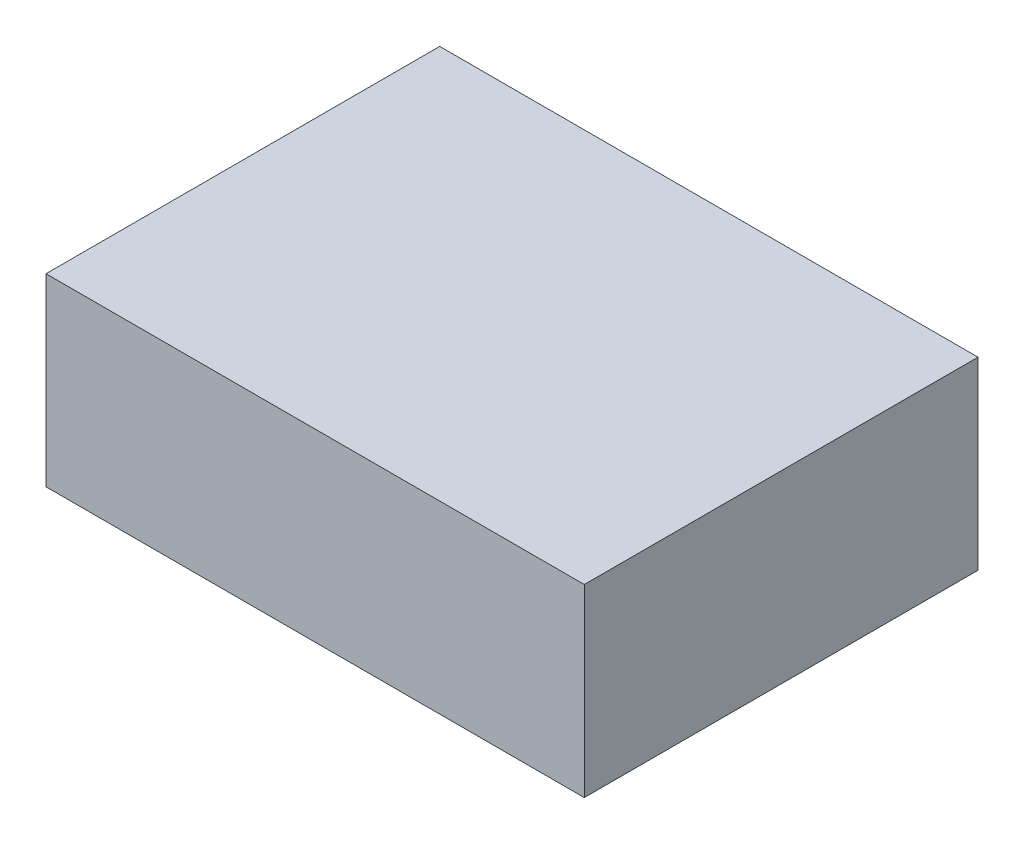
ISO-10303-21;
HEADER;
FILE_DESCRIPTION(('STEP AP214'),'2;1');
FILE_NAME('part.step','',(''),(''),'','','');
FILE_SCHEMA(('AUTOMOTIVE_DESIGN { 1 0 10303 214 1 1 1 1 }'));
ENDSEC;
DATA;
#1=APPLICATION_CONTEXT('core data for automotive mechanical design processes');
#2=APPLICATION_PROTOCOL_DEFINITION('international standard','automotive_design',2000,#1);
#3=PRODUCT_CONTEXT('',#1,'mechanical');
#4=PRODUCT('Part','Part','',(#3));
#5=PRODUCT_RELATED_PRODUCT_CATEGORY('part','',(#4));
#6=PRODUCT_DEFINITION_FORMATION('','',#4);
#7=PRODUCT_DEFINITION_CONTEXT('part definition',#1,'design');
#8=PRODUCT_DEFINITION('design','',#6,#7);
#9=PRODUCT_DEFINITION_SHAPE('','',#8);
#10=(LENGTH_UNIT() NAMED_UNIT(*) SI_UNIT(.MILLI.,.METRE.));
#11=(NAMED_UNIT(*) PLANE_ANGLE_UNIT() SI_UNIT($,.RADIAN.));
#12=(NAMED_UNIT(*) SI_UNIT($,.STERADIAN.) SOLID_ANGLE_UNIT());
#13=UNCERTAINTY_MEASURE_WITH_UNIT(LENGTH_MEASURE(1.E-05),#10,'distance_accuracy_value','');
#14=(GEOMETRIC_REPRESENTATION_CONTEXT(3) GLOBAL_UNCERTAINTY_ASSIGNED_CONTEXT((#13)) GLOBAL_UNIT_ASSIGNED_CONTEXT((#10,
#11,#12)) REPRESENTATION_CONTEXT('',''));
#15=CARTESIAN_POINT('',(0.,0.,0.));
#16=DIRECTION('',(0.,0.,1.));
#17=DIRECTION('',(1.,0.,0.));
#18=AXIS2_PLACEMENT_3D('',#15,#16,#17);
#19=CARTESIAN_POINT('',(87.5,60.,-64.));
#20=DIRECTION('',(-1.,0.,0.));
#21=DIRECTION('',(0.,0.,1.));
#22=AXIS2_PLACEMENT_3D('',#19,#20,#21);
#23=PLANE('',#22);
#24=DIRECTION('',(0.,0.,-1.));
#25=VECTOR('',#24,1.);
#26=CARTESIAN_POINT('',(87.5,0.,-64.));
#27=LINE('',#26,#25);
#28=CARTESIAN_POINT('',(87.5,0.,64.));
#29=VERTEX_POINT('',#28);
#30=CARTESIAN_POINT('',(87.5,0.,-64.));
#31=VERTEX_POINT('',#30);
#32=EDGE_CURVE('E113',#29,#31,#27,.T.);
#33=ORIENTED_EDGE('',*,*,#32,.T.);
#34=DIRECTION('',(0.,-1.,0.));
#35=VECTOR('',#34,1.);
#36=CARTESIAN_POINT('',(87.5,60.,-64.));
#37=LINE('',#36,#35);
#38=CARTESIAN_POINT('',(87.5,60.,-64.));
#39=VERTEX_POINT('',#38);
#40=EDGE_CURVE('E11',#39,#31,#37,.T.);
#41=ORIENTED_EDGE('',*,*,#40,.F.);
#42=DIRECTION('',(0.,0.,-1.));
#43=VECTOR('',#42,1.);
#44=CARTESIAN_POINT('',(87.5,60.,-64.));
#45=LINE('',#44,#43);
#46=CARTESIAN_POINT('',(87.5,60.,64.));
#47=VERTEX_POINT('',#46);
#48=EDGE_CURVE('E97',#47,#39,#45,.T.);
#49=ORIENTED_EDGE('',*,*,#48,.F.);
#50=DIRECTION('',(0.,-1.,0.));
#51=VECTOR('',#50,1.);
#52=CARTESIAN_POINT('',(87.5,60.,64.));
#53=LINE('',#52,#51);
#54=EDGE_CURVE('E109',#47,#29,#53,.T.);
#55=ORIENTED_EDGE('',*,*,#54,.T.);
#56=EDGE_LOOP('',(#33,#41,#49,#55));
#57=FACE_BOUND('',#56,.T.);
#58=ADVANCED_FACE('F45',(#57),#23,.F.);
#59=CARTESIAN_POINT('',(-87.5,60.,-64.));
#60=DIRECTION('',(0.,0.,1.));
#61=DIRECTION('',(1.,0.,0.));
#62=AXIS2_PLACEMENT_3D('',#59,#60,#61);
#63=PLANE('',#62);
#64=DIRECTION('',(-1.,0.,0.));
#65=VECTOR('',#64,1.);
#66=CARTESIAN_POINT('',(-87.5,0.,-64.));
#67=LINE('',#66,#65);
#68=CARTESIAN_POINT('',(-87.5,0.,-64.));
#69=VERTEX_POINT('',#68);
#70=EDGE_CURVE('E102',#31,#69,#67,.T.);
#71=ORIENTED_EDGE('',*,*,#70,.T.);
#72=DIRECTION('',(0.,-1.,0.));
#73=VECTOR('',#72,1.);
#74=CARTESIAN_POINT('',(-87.5,60.,-64.));
#75=LINE('',#74,#73);
#76=CARTESIAN_POINT('',(-87.5,60.,-64.));
#77=VERTEX_POINT('',#76);
#78=EDGE_CURVE('E54',#77,#69,#75,.T.);
#79=ORIENTED_EDGE('',*,*,#78,.F.);
#80=DIRECTION('',(-1.,0.,0.));
#81=VECTOR('',#80,1.);
#82=CARTESIAN_POINT('',(-87.5,60.,-64.));
#83=LINE('',#82,#81);
#84=EDGE_CURVE('E92',#39,#77,#83,.T.);
#85=ORIENTED_EDGE('',*,*,#84,.F.);
#86=ORIENTED_EDGE('',*,*,#40,.T.);
#87=EDGE_LOOP('',(#71,#79,#85,#86));
#88=FACE_BOUND('',#87,.T.);
#89=ADVANCED_FACE('F101',(#88),#63,.F.);
#90=CARTESIAN_POINT('',(-87.5,60.,-64.));
#91=DIRECTION('',(1.,0.,0.));
#92=DIRECTION('',(0.,0.,-1.));
#93=AXIS2_PLACEMENT_3D('',#90,#91,#92);
#94=PLANE('',#93);
#95=DIRECTION('',(0.,0.,1.));
#96=VECTOR('',#95,1.);
#97=CARTESIAN_POINT('',(-87.5,0.,-64.));
#98=LINE('',#97,#96);
#99=CARTESIAN_POINT('',(-87.5,0.,64.));
#100=VERTEX_POINT('',#99);
#101=EDGE_CURVE('E79',#69,#100,#98,.T.);
#102=ORIENTED_EDGE('',*,*,#101,.T.);
#103=DIRECTION('',(0.,-1.,0.));
#104=VECTOR('',#103,1.);
#105=CARTESIAN_POINT('',(-87.5,60.,64.));
#106=LINE('',#105,#104);
#107=CARTESIAN_POINT('',(-87.5,60.,64.));
#108=VERTEX_POINT('',#107);
#109=EDGE_CURVE('E104',#108,#100,#106,.T.);
#110=ORIENTED_EDGE('',*,*,#109,.F.);
#111=DIRECTION('',(0.,0.,1.));
#112=VECTOR('',#111,1.);
#113=CARTESIAN_POINT('',(-87.5,60.,-64.));
#114=LINE('',#113,#112);
#115=EDGE_CURVE('E95',#77,#108,#114,.T.);
#116=ORIENTED_EDGE('',*,*,#115,.F.);
#117=ORIENTED_EDGE('',*,*,#78,.T.);
#118=EDGE_LOOP('',(#102,#110,#116,#117));
#119=FACE_BOUND('',#118,.T.);
#120=ADVANCED_FACE('F105',(#119),#94,.F.);
#121=CARTESIAN_POINT('',(-87.5,60.,64.));
#122=DIRECTION('',(0.,0.,-1.));
#123=DIRECTION('',(-1.,0.,0.));
#124=AXIS2_PLACEMENT_3D('',#121,#122,#123);
#125=PLANE('',#124);
#126=DIRECTION('',(1.,0.,0.));
#127=VECTOR('',#126,1.);
#128=CARTESIAN_POINT('',(-87.5,0.,64.));
#129=LINE('',#128,#127);
#130=EDGE_CURVE('E85',#100,#29,#129,.T.);
#131=ORIENTED_EDGE('',*,*,#130,.T.);
#132=ORIENTED_EDGE('',*,*,#54,.F.);
#133=DIRECTION('',(1.,0.,0.));
#134=VECTOR('',#133,1.);
#135=CARTESIAN_POINT('',(-87.5,60.,64.));
#136=LINE('',#135,#134);
#137=EDGE_CURVE('E62',#108,#47,#136,.T.);
#138=ORIENTED_EDGE('',*,*,#137,.F.);
#139=ORIENTED_EDGE('',*,*,#109,.T.);
#140=EDGE_LOOP('',(#131,#132,#138,#139));
#141=FACE_BOUND('',#140,.T.);
#142=ADVANCED_FACE('F126',(#141),#125,.F.);
#143=CARTESIAN_POINT('',(0.,60.,0.));
#144=DIRECTION('',(0.,1.,0.));
#145=DIRECTION('',(0.,0.,1.));
#146=AXIS2_PLACEMENT_3D('',#143,#144,#145);
#147=PLANE('',#146);
#148=ORIENTED_EDGE('',*,*,#48,.T.);
#149=ORIENTED_EDGE('',*,*,#84,.T.);
#150=ORIENTED_EDGE('',*,*,#115,.T.);
#151=ORIENTED_EDGE('',*,*,#137,.T.);
#152=EDGE_LOOP('',(#148,#149,#150,#151));
#153=FACE_BOUND('',#152,.T.);
#154=ADVANCED_FACE('F93',(#153),#147,.T.);
#155=CARTESIAN_POINT('',(0.,0.,0.));
#156=DIRECTION('',(0.,1.,0.));
#157=DIRECTION('',(0.,0.,1.));
#158=AXIS2_PLACEMENT_3D('',#155,#156,#157);
#159=PLANE('',#158);
#160=ORIENTED_EDGE('',*,*,#32,.F.);
#161=ORIENTED_EDGE('',*,*,#130,.F.);
#162=ORIENTED_EDGE('',*,*,#101,.F.);
#163=ORIENTED_EDGE('',*,*,#70,.F.);
#164=EDGE_LOOP('',(#160,#161,#162,#163));
#165=FACE_BOUND('',#164,.T.);
#166=ADVANCED_FACE('F129',(#165),#159,.F.);
#167=CLOSED_SHELL('',(#58,#89,#120,#142,#154,#166));
#168=MANIFOLD_SOLID_BREP('B2',#167);
#169=ADVANCED_BREP_SHAPE_REPRESENTATION('',(#18,#168),#14);
#170=SHAPE_DEFINITION_REPRESENTATION(#9,#169);
ENDSEC;
END-ISO-10303-21;
